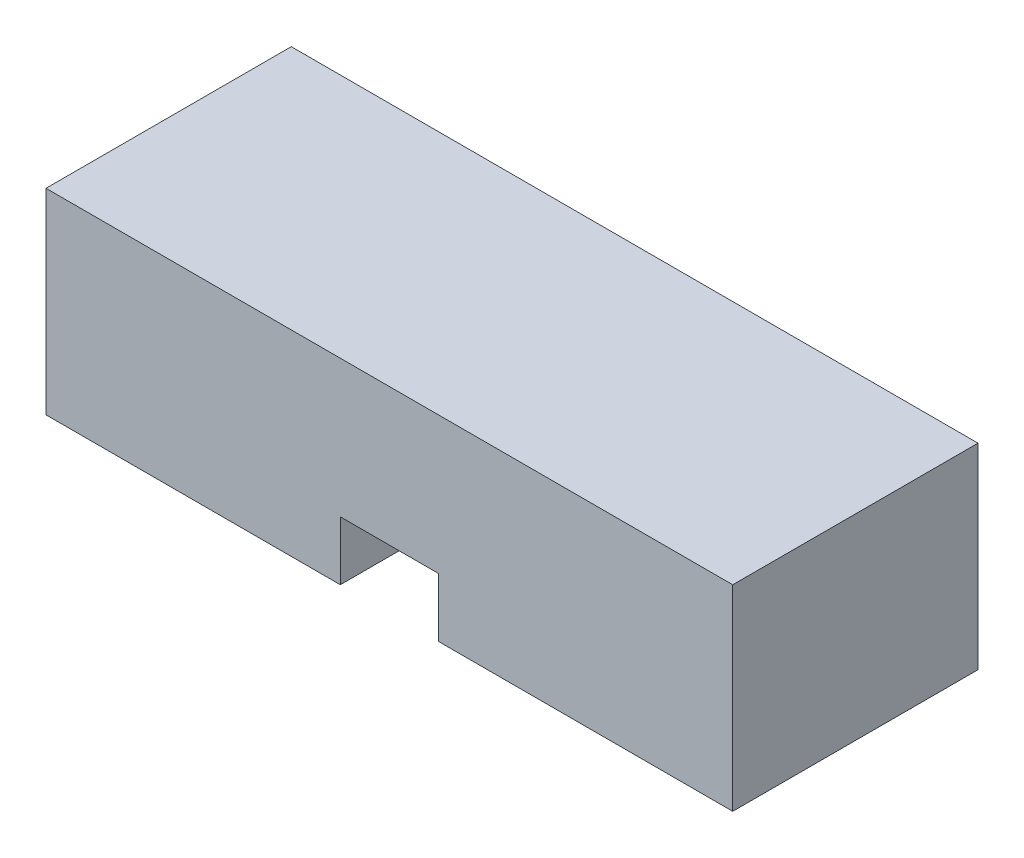
ISO-10303-21;
HEADER;
FILE_DESCRIPTION(('STEP AP214'),'2;1');
FILE_NAME('part.step','',(''),(''),'','','');
FILE_SCHEMA(('AUTOMOTIVE_DESIGN { 1 0 10303 214 1 1 1 1 }'));
ENDSEC;
DATA;
#1=APPLICATION_CONTEXT('core data for automotive mechanical design processes');
#2=APPLICATION_PROTOCOL_DEFINITION('international standard','automotive_design',2000,#1);
#3=PRODUCT_CONTEXT('',#1,'mechanical');
#4=PRODUCT('Part','Part','',(#3));
#5=PRODUCT_RELATED_PRODUCT_CATEGORY('part','',(#4));
#6=PRODUCT_DEFINITION_FORMATION('','',#4);
#7=PRODUCT_DEFINITION_CONTEXT('part definition',#1,'design');
#8=PRODUCT_DEFINITION('design','',#6,#7);
#9=PRODUCT_DEFINITION_SHAPE('','',#8);
#10=(LENGTH_UNIT() NAMED_UNIT(*) SI_UNIT(.MILLI.,.METRE.));
#11=(NAMED_UNIT(*) PLANE_ANGLE_UNIT() SI_UNIT($,.RADIAN.));
#12=(NAMED_UNIT(*) SI_UNIT($,.STERADIAN.) SOLID_ANGLE_UNIT());
#13=UNCERTAINTY_MEASURE_WITH_UNIT(LENGTH_MEASURE(1.E-05),#10,'distance_accuracy_value','');
#14=(GEOMETRIC_REPRESENTATION_CONTEXT(3) GLOBAL_UNCERTAINTY_ASSIGNED_CONTEXT((#13)) GLOBAL_UNIT_ASSIGNED_CONTEXT((#10,
#11,#12)) REPRESENTATION_CONTEXT('',''));
#15=CARTESIAN_POINT('',(0.,0.,0.));
#16=DIRECTION('',(0.,0.,1.));
#17=DIRECTION('',(1.,0.,0.));
#18=AXIS2_PLACEMENT_3D('',#15,#16,#17);
#19=CARTESIAN_POINT('',(0.,-20.,0.));
#20=DIRECTION('',(0.,1.,0.));
#21=DIRECTION('',(0.,0.,1.));
#22=AXIS2_PLACEMENT_3D('',#19,#20,#21);
#23=PLANE('',#22);
#24=DIRECTION('',(1.,0.,0.));
#25=VECTOR('',#24,1.);
#26=CARTESIAN_POINT('',(-35.,-20.,12.5));
#27=LINE('',#26,#25);
#28=CARTESIAN_POINT('',(5.,-20.,12.5));
#29=VERTEX_POINT('',#28);
#30=CARTESIAN_POINT('',(35.,-20.,12.5));
#31=VERTEX_POINT('',#30);
#32=EDGE_CURVE('E222',#29,#31,#27,.T.);
#33=ORIENTED_EDGE('',*,*,#32,.F.);
#34=DIRECTION('',(0.,0.,1.));
#35=VECTOR('',#34,1.);
#36=CARTESIAN_POINT('',(5.,-20.,-12.5));
#37=LINE('',#36,#35);
#38=CARTESIAN_POINT('',(5.,-20.,3.07373240182346));
#39=VERTEX_POINT('',#38);
#40=EDGE_CURVE('E163',#39,#29,#37,.T.);
#41=ORIENTED_EDGE('',*,*,#40,.F.);
#42=CARTESIAN_POINT('',(10.95,-20.,-2.19883812876217));
#43=DIRECTION('',(0.,-1.,0.));
#44=DIRECTION('',(0.,0.,-1.));
#45=AXIS2_PLACEMENT_3D('',#42,#43,#44);
#46=CIRCLE('',#45,7.95);
#47=CARTESIAN_POINT('',(5.,-20.,-7.4714086593478));
#48=VERTEX_POINT('',#47);
#49=EDGE_CURVE('E198',#48,#39,#46,.T.);
#50=ORIENTED_EDGE('',*,*,#49,.F.);
#51=CARTESIAN_POINT('',(5.,-20.,-12.5));
#52=VERTEX_POINT('',#51);
#53=EDGE_CURVE('E184',#52,#48,#37,.T.);
#54=ORIENTED_EDGE('',*,*,#53,.F.);
#55=DIRECTION('',(-1.,0.,0.));
#56=VECTOR('',#55,1.);
#57=CARTESIAN_POINT('',(-35.,-20.,-12.5));
#58=LINE('',#57,#56);
#59=CARTESIAN_POINT('',(35.,-20.,-12.5));
#60=VERTEX_POINT('',#59);
#61=EDGE_CURVE('E216',#60,#52,#58,.T.);
#62=ORIENTED_EDGE('',*,*,#61,.F.);
#63=DIRECTION('',(0.,0.,-1.));
#64=VECTOR('',#63,1.);
#65=CARTESIAN_POINT('',(35.,-20.,-12.5));
#66=LINE('',#65,#64);
#67=EDGE_CURVE('E211',#31,#60,#66,.T.);
#68=ORIENTED_EDGE('',*,*,#67,.F.);
#69=EDGE_LOOP('',(#33,#41,#50,#54,#62,#68));
#70=FACE_BOUND('',#69,.T.);
#71=ADVANCED_FACE('F35',(#70),#23,.F.);
#72=CARTESIAN_POINT('',(35.,-20.,-12.5));
#73=DIRECTION('',(1.,0.,0.));
#74=DIRECTION('',(0.,0.,-1.));
#75=AXIS2_PLACEMENT_3D('',#72,#73,#74);
#76=PLANE('',#75);
#77=DIRECTION('',(0.,0.,-1.));
#78=VECTOR('',#77,1.);
#79=CARTESIAN_POINT('',(35.,0.,-12.5));
#80=LINE('',#79,#78);
#81=CARTESIAN_POINT('',(35.,0.,12.5));
#82=VERTEX_POINT('',#81);
#83=CARTESIAN_POINT('',(35.,0.,-12.5));
#84=VERTEX_POINT('',#83);
#85=EDGE_CURVE('E208',#82,#84,#80,.T.);
#86=ORIENTED_EDGE('',*,*,#85,.F.);
#87=DIRECTION('',(0.,1.,0.));
#88=VECTOR('',#87,1.);
#89=CARTESIAN_POINT('',(35.,-20.,12.5));
#90=LINE('',#89,#88);
#91=EDGE_CURVE('E236',#31,#82,#90,.T.);
#92=ORIENTED_EDGE('',*,*,#91,.F.);
#93=ORIENTED_EDGE('',*,*,#67,.T.);
#94=DIRECTION('',(0.,1.,0.));
#95=VECTOR('',#94,1.);
#96=CARTESIAN_POINT('',(35.,-20.,-12.5));
#97=LINE('',#96,#95);
#98=EDGE_CURVE('E225',#60,#84,#97,.T.);
#99=ORIENTED_EDGE('',*,*,#98,.T.);
#100=EDGE_LOOP('',(#86,#92,#93,#99));
#101=FACE_BOUND('',#100,.T.);
#102=ADVANCED_FACE('F296',(#101),#76,.T.);
#103=CARTESIAN_POINT('',(-35.,-20.,12.5));
#104=DIRECTION('',(0.,0.,1.));
#105=DIRECTION('',(1.,0.,0.));
#106=AXIS2_PLACEMENT_3D('',#103,#104,#105);
#107=PLANE('',#106);
#108=DIRECTION('',(-1.,0.,0.));
#109=VECTOR('',#108,1.);
#110=CARTESIAN_POINT('',(-5.,-14.,12.5));
#111=LINE('',#110,#109);
#112=CARTESIAN_POINT('',(5.,-14.,12.5));
#113=VERTEX_POINT('',#112);
#114=CARTESIAN_POINT('',(-5.,-14.,12.5));
#115=VERTEX_POINT('',#114);
#116=EDGE_CURVE('E152',#113,#115,#111,.T.);
#117=ORIENTED_EDGE('',*,*,#116,.F.);
#118=DIRECTION('',(0.,-1.,0.));
#119=VECTOR('',#118,1.);
#120=CARTESIAN_POINT('',(5.,-16.,12.5));
#121=LINE('',#120,#119);
#122=EDGE_CURVE('E160',#113,#29,#121,.T.);
#123=ORIENTED_EDGE('',*,*,#122,.T.);
#124=ORIENTED_EDGE('',*,*,#32,.T.);
#125=ORIENTED_EDGE('',*,*,#91,.T.);
#126=DIRECTION('',(1.,0.,0.));
#127=VECTOR('',#126,1.);
#128=CARTESIAN_POINT('',(-35.,0.,12.5));
#129=LINE('',#128,#127);
#130=CARTESIAN_POINT('',(-35.,0.,12.5));
#131=VERTEX_POINT('',#130);
#132=EDGE_CURVE('E215',#131,#82,#129,.T.);
#133=ORIENTED_EDGE('',*,*,#132,.F.);
#134=DIRECTION('',(0.,1.,0.));
#135=VECTOR('',#134,1.);
#136=CARTESIAN_POINT('',(-35.,-20.,12.5));
#137=LINE('',#136,#135);
#138=CARTESIAN_POINT('',(-35.,-20.,12.5));
#139=VERTEX_POINT('',#138);
#140=EDGE_CURVE('E239',#139,#131,#137,.T.);
#141=ORIENTED_EDGE('',*,*,#140,.F.);
#142=CARTESIAN_POINT('',(-5.,-20.,12.5));
#143=VERTEX_POINT('',#142);
#144=EDGE_CURVE('E223',#139,#143,#27,.T.);
#145=ORIENTED_EDGE('',*,*,#144,.T.);
#146=DIRECTION('',(0.,-1.,0.));
#147=VECTOR('',#146,1.);
#148=CARTESIAN_POINT('',(-5.,-16.,12.5));
#149=LINE('',#148,#147);
#150=EDGE_CURVE('E166',#115,#143,#149,.T.);
#151=ORIENTED_EDGE('',*,*,#150,.F.);
#152=EDGE_LOOP('',(#117,#123,#124,#125,#133,#141,#145,#151));
#153=FACE_BOUND('',#152,.T.);
#154=ADVANCED_FACE('F169',(#153),#107,.T.);
#155=CARTESIAN_POINT('',(-35.,-20.,-12.5));
#156=DIRECTION('',(-1.,0.,0.));
#157=DIRECTION('',(0.,0.,1.));
#158=AXIS2_PLACEMENT_3D('',#155,#156,#157);
#159=PLANE('',#158);
#160=DIRECTION('',(0.,0.,1.));
#161=VECTOR('',#160,1.);
#162=CARTESIAN_POINT('',(-35.,0.,-12.5));
#163=LINE('',#162,#161);
#164=CARTESIAN_POINT('',(-35.,0.,-12.5));
#165=VERTEX_POINT('',#164);
#166=EDGE_CURVE('E231',#165,#131,#163,.T.);
#167=ORIENTED_EDGE('',*,*,#166,.F.);
#168=DIRECTION('',(0.,1.,0.));
#169=VECTOR('',#168,1.);
#170=CARTESIAN_POINT('',(-35.,-20.,-12.5));
#171=LINE('',#170,#169);
#172=CARTESIAN_POINT('',(-35.,-20.,-12.5));
#173=VERTEX_POINT('',#172);
#174=EDGE_CURVE('E241',#173,#165,#171,.T.);
#175=ORIENTED_EDGE('',*,*,#174,.F.);
#176=DIRECTION('',(0.,0.,1.));
#177=VECTOR('',#176,1.);
#178=CARTESIAN_POINT('',(-35.,-20.,-12.5));
#179=LINE('',#178,#177);
#180=EDGE_CURVE('E219',#173,#139,#179,.T.);
#181=ORIENTED_EDGE('',*,*,#180,.T.);
#182=ORIENTED_EDGE('',*,*,#140,.T.);
#183=EDGE_LOOP('',(#167,#175,#181,#182));
#184=FACE_BOUND('',#183,.T.);
#185=ADVANCED_FACE('F305',(#184),#159,.T.);
#186=CARTESIAN_POINT('',(-35.,-20.,-12.5));
#187=DIRECTION('',(0.,0.,-1.));
#188=DIRECTION('',(-1.,0.,0.));
#189=AXIS2_PLACEMENT_3D('',#186,#187,#188);
#190=PLANE('',#189);
#191=DIRECTION('',(0.,-1.,0.));
#192=VECTOR('',#191,1.);
#193=CARTESIAN_POINT('',(5.,-16.,-12.5));
#194=LINE('',#193,#192);
#195=CARTESIAN_POINT('',(5.,-16.,-12.5));
#196=VERTEX_POINT('',#195);
#197=EDGE_CURVE('E189',#196,#52,#194,.T.);
#198=ORIENTED_EDGE('',*,*,#197,.F.);
#199=DIRECTION('',(1.,0.,0.));
#200=VECTOR('',#199,1.);
#201=CARTESIAN_POINT('',(-5.,-16.,-12.5));
#202=LINE('',#201,#200);
#203=CARTESIAN_POINT('',(-5.,-16.,-12.5));
#204=VERTEX_POINT('',#203);
#205=EDGE_CURVE('E167',#204,#196,#202,.T.);
#206=ORIENTED_EDGE('',*,*,#205,.F.);
#207=DIRECTION('',(0.,-1.,0.));
#208=VECTOR('',#207,1.);
#209=CARTESIAN_POINT('',(-5.,-16.,-12.5));
#210=LINE('',#209,#208);
#211=CARTESIAN_POINT('',(-5.,-20.,-12.5));
#212=VERTEX_POINT('',#211);
#213=EDGE_CURVE('E192',#204,#212,#210,.T.);
#214=ORIENTED_EDGE('',*,*,#213,.T.);
#215=EDGE_CURVE('E214',#212,#173,#58,.T.);
#216=ORIENTED_EDGE('',*,*,#215,.T.);
#217=ORIENTED_EDGE('',*,*,#174,.T.);
#218=DIRECTION('',(-1.,0.,0.));
#219=VECTOR('',#218,1.);
#220=CARTESIAN_POINT('',(-35.,0.,-12.5));
#221=LINE('',#220,#219);
#222=EDGE_CURVE('E228',#84,#165,#221,.T.);
#223=ORIENTED_EDGE('',*,*,#222,.F.);
#224=ORIENTED_EDGE('',*,*,#98,.F.);
#225=ORIENTED_EDGE('',*,*,#61,.T.);
#226=EDGE_LOOP('',(#198,#206,#214,#216,#217,#223,#224,#225));
#227=FACE_BOUND('',#226,.T.);
#228=ADVANCED_FACE('F323',(#227),#190,.T.);
#229=ORIENTED_EDGE('',*,*,#215,.F.);
#230=DIRECTION('',(0.,0.,-1.));
#231=VECTOR('',#230,1.);
#232=CARTESIAN_POINT('',(-5.,-20.,-12.5));
#233=LINE('',#232,#231);
#234=CARTESIAN_POINT('',(-5.,-20.,-7.4714086593478));
#235=VERTEX_POINT('',#234);
#236=EDGE_CURVE('E186',#235,#212,#233,.T.);
#237=ORIENTED_EDGE('',*,*,#236,.F.);
#238=CARTESIAN_POINT('',(-10.95,-20.,-2.19883812876217));
#239=DIRECTION('',(0.,-1.,0.));
#240=DIRECTION('',(0.,0.,-1.));
#241=AXIS2_PLACEMENT_3D('',#238,#239,#240);
#242=CIRCLE('',#241,7.95);
#243=CARTESIAN_POINT('',(-5.,-20.,3.07373240182346));
#244=VERTEX_POINT('',#243);
#245=EDGE_CURVE('E202',#244,#235,#242,.T.);
#246=ORIENTED_EDGE('',*,*,#245,.F.);
#247=EDGE_CURVE('E187',#143,#244,#233,.T.);
#248=ORIENTED_EDGE('',*,*,#247,.F.);
#249=ORIENTED_EDGE('',*,*,#144,.F.);
#250=ORIENTED_EDGE('',*,*,#180,.F.);
#251=EDGE_LOOP('',(#229,#237,#246,#248,#249,#250));
#252=FACE_BOUND('',#251,.T.);
#253=ADVANCED_FACE('F309',(#252),#23,.F.);
#254=CARTESIAN_POINT('',(0.,0.,0.));
#255=DIRECTION('',(0.,1.,0.));
#256=DIRECTION('',(0.,0.,1.));
#257=AXIS2_PLACEMENT_3D('',#254,#255,#256);
#258=PLANE('',#257);
#259=ORIENTED_EDGE('',*,*,#85,.T.);
#260=ORIENTED_EDGE('',*,*,#222,.T.);
#261=ORIENTED_EDGE('',*,*,#166,.T.);
#262=ORIENTED_EDGE('',*,*,#132,.T.);
#263=EDGE_LOOP('',(#259,#260,#261,#262));
#264=FACE_BOUND('',#263,.T.);
#265=ADVANCED_FACE('F299',(#264),#258,.T.);
#266=CARTESIAN_POINT('',(-10.95,-13.,-2.19883812876217));
#267=DIRECTION('',(0.,-1.,0.));
#268=DIRECTION('',(0.,0.,-1.));
#269=AXIS2_PLACEMENT_3D('',#266,#267,#268);
#270=CYLINDRICAL_SURFACE('',#269,7.95);
#271=ORIENTED_EDGE('',*,*,#245,.T.);
#272=DIRECTION('',(0.,-1.,0.));
#273=VECTOR('',#272,1.);
#274=CARTESIAN_POINT('',(-5.,-13.,-7.4714086593478));
#275=LINE('',#274,#273);
#276=CARTESIAN_POINT('',(-5.,-16.,-7.4714086593478));
#277=VERTEX_POINT('',#276);
#278=EDGE_CURVE('E255',#235,#277,#275,.F.);
#279=ORIENTED_EDGE('',*,*,#278,.T.);
#280=CARTESIAN_POINT('',(-10.95,-16.,-2.19883812876217));
#281=DIRECTION('',(0.,1.,0.));
#282=DIRECTION('',(0.,0.,1.));
#283=AXIS2_PLACEMENT_3D('',#280,#281,#282);
#284=CIRCLE('',#283,7.95);
#285=CARTESIAN_POINT('',(-5.,-16.,3.07373240182346));
#286=VERTEX_POINT('',#285);
#287=EDGE_CURVE('E191',#277,#286,#284,.F.);
#288=ORIENTED_EDGE('',*,*,#287,.T.);
#289=DIRECTION('',(0.,-1.,0.));
#290=VECTOR('',#289,1.);
#291=CARTESIAN_POINT('',(-5.,-13.,3.07373240182346));
#292=LINE('',#291,#290);
#293=EDGE_CURVE('E252',#286,#244,#292,.T.);
#294=ORIENTED_EDGE('',*,*,#293,.T.);
#295=EDGE_LOOP('',(#271,#279,#288,#294));
#296=FACE_BOUND('',#295,.T.);
#297=CARTESIAN_POINT('',(-10.95,-13.,-2.19883812876217));
#298=DIRECTION('',(0.,-1.,0.));
#299=DIRECTION('',(0.,0.,-1.));
#300=AXIS2_PLACEMENT_3D('',#297,#298,#299);
#301=CIRCLE('',#300,7.95);
#302=CARTESIAN_POINT('',(-10.95,-13.,-10.1488381287622));
#303=VERTEX_POINT('',#302);
#304=EDGE_CURVE('E205',#303,#303,#301,.T.);
#305=ORIENTED_EDGE('',*,*,#304,.F.);
#306=EDGE_LOOP('',(#305));
#307=FACE_BOUND('',#306,.T.);
#308=ADVANCED_FACE('F314',(#296,#307),#270,.F.);
#309=CARTESIAN_POINT('',(-10.95,-13.,-2.19883812876217));
#310=DIRECTION('',(0.,-1.,0.));
#311=DIRECTION('',(0.,0.,-1.));
#312=AXIS2_PLACEMENT_3D('',#309,#310,#311);
#313=PLANE('',#312);
#314=ORIENTED_EDGE('',*,*,#304,.T.);
#315=EDGE_LOOP('',(#314));
#316=FACE_BOUND('',#315,.T.);
#317=ADVANCED_FACE('F375',(#316),#313,.T.);
#318=CARTESIAN_POINT('',(10.95,-13.,-2.19883812876217));
#319=DIRECTION('',(0.,-1.,0.));
#320=DIRECTION('',(0.,0.,-1.));
#321=AXIS2_PLACEMENT_3D('',#318,#319,#320);
#322=CYLINDRICAL_SURFACE('',#321,7.95);
#323=ORIENTED_EDGE('',*,*,#49,.T.);
#324=DIRECTION('',(0.,-1.,0.));
#325=VECTOR('',#324,1.);
#326=CARTESIAN_POINT('',(5.,-13.,3.07373240182346));
#327=LINE('',#326,#325);
#328=CARTESIAN_POINT('',(5.,-16.,3.07373240182346));
#329=VERTEX_POINT('',#328);
#330=EDGE_CURVE('E249',#39,#329,#327,.F.);
#331=ORIENTED_EDGE('',*,*,#330,.T.);
#332=CARTESIAN_POINT('',(10.95,-16.,-2.19883812876217));
#333=DIRECTION('',(0.,1.,0.));
#334=DIRECTION('',(0.,0.,1.));
#335=AXIS2_PLACEMENT_3D('',#332,#333,#334);
#336=CIRCLE('',#335,7.95);
#337=CARTESIAN_POINT('',(5.,-16.,-7.4714086593478));
#338=VERTEX_POINT('',#337);
#339=EDGE_CURVE('E238',#329,#338,#336,.F.);
#340=ORIENTED_EDGE('',*,*,#339,.T.);
#341=DIRECTION('',(0.,-1.,0.));
#342=VECTOR('',#341,1.);
#343=CARTESIAN_POINT('',(5.,-13.,-7.4714086593478));
#344=LINE('',#343,#342);
#345=EDGE_CURVE('E246',#338,#48,#344,.T.);
#346=ORIENTED_EDGE('',*,*,#345,.T.);
#347=EDGE_LOOP('',(#323,#331,#340,#346));
#348=FACE_BOUND('',#347,.T.);
#349=CARTESIAN_POINT('',(10.95,-13.,-2.19883812876217));
#350=DIRECTION('',(0.,-1.,0.));
#351=DIRECTION('',(0.,0.,-1.));
#352=AXIS2_PLACEMENT_3D('',#349,#350,#351);
#353=CIRCLE('',#352,7.95);
#354=CARTESIAN_POINT('',(10.95,-13.,-10.1488381287622));
#355=VERTEX_POINT('',#354);
#356=EDGE_CURVE('E199',#355,#355,#353,.T.);
#357=ORIENTED_EDGE('',*,*,#356,.F.);
#358=EDGE_LOOP('',(#357));
#359=FACE_BOUND('',#358,.T.);
#360=ADVANCED_FACE('F284',(#348,#359),#322,.F.);
#361=CARTESIAN_POINT('',(10.95,-13.,-2.19883812876217));
#362=DIRECTION('',(0.,-1.,0.));
#363=DIRECTION('',(0.,0.,-1.));
#364=AXIS2_PLACEMENT_3D('',#361,#362,#363);
#365=PLANE('',#364);
#366=ORIENTED_EDGE('',*,*,#356,.T.);
#367=EDGE_LOOP('',(#366));
#368=FACE_BOUND('',#367,.T.);
#369=ADVANCED_FACE('F366',(#368),#365,.T.);
#370=CARTESIAN_POINT('',(-5.,-16.,-12.5));
#371=DIRECTION('',(-1.,0.,0.));
#372=DIRECTION('',(0.,0.,1.));
#373=AXIS2_PLACEMENT_3D('',#370,#371,#372);
#374=PLANE('',#373);
#375=ORIENTED_EDGE('',*,*,#236,.T.);
#376=ORIENTED_EDGE('',*,*,#213,.F.);
#377=DIRECTION('',(0.,0.,-1.));
#378=VECTOR('',#377,1.);
#379=CARTESIAN_POINT('',(-5.,-16.,-12.5));
#380=LINE('',#379,#378);
#381=EDGE_CURVE('E179',#277,#204,#380,.T.);
#382=ORIENTED_EDGE('',*,*,#381,.F.);
#383=ORIENTED_EDGE('',*,*,#278,.F.);
#384=EDGE_LOOP('',(#375,#376,#382,#383));
#385=FACE_BOUND('',#384,.T.);
#386=ADVANCED_FACE('F319',(#385),#374,.F.);
#387=CARTESIAN_POINT('',(-5.,-16.,6.7));
#388=VERTEX_POINT('',#387);
#389=EDGE_CURVE('E50',#388,#286,#380,.T.);
#390=ORIENTED_EDGE('',*,*,#389,.F.);
#391=DIRECTION('',(0.,-1.,0.));
#392=VECTOR('',#391,1.);
#393=CARTESIAN_POINT('',(-5.,-14.,6.7));
#394=LINE('',#393,#392);
#395=CARTESIAN_POINT('',(-5.,-14.,6.7));
#396=VERTEX_POINT('',#395);
#397=EDGE_CURVE('E54',#388,#396,#394,.F.);
#398=ORIENTED_EDGE('',*,*,#397,.T.);
#399=DIRECTION('',(0.,0.,-1.));
#400=VECTOR('',#399,1.);
#401=CARTESIAN_POINT('',(-5.,-14.,3.5));
#402=LINE('',#401,#400);
#403=EDGE_CURVE('E171',#115,#396,#402,.T.);
#404=ORIENTED_EDGE('',*,*,#403,.F.);
#405=ORIENTED_EDGE('',*,*,#150,.T.);
#406=ORIENTED_EDGE('',*,*,#247,.T.);
#407=ORIENTED_EDGE('',*,*,#293,.F.);
#408=EDGE_LOOP('',(#390,#398,#404,#405,#406,#407));
#409=FACE_BOUND('',#408,.T.);
#410=ADVANCED_FACE('F312',(#409),#374,.F.);
#411=CARTESIAN_POINT('',(5.,-16.,-12.5));
#412=DIRECTION('',(1.,0.,0.));
#413=DIRECTION('',(0.,0.,-1.));
#414=AXIS2_PLACEMENT_3D('',#411,#412,#413);
#415=PLANE('',#414);
#416=DIRECTION('',(0.,0.,1.));
#417=VECTOR('',#416,1.);
#418=CARTESIAN_POINT('',(5.,-14.,3.5));
#419=LINE('',#418,#417);
#420=CARTESIAN_POINT('',(5.,-14.,6.7));
#421=VERTEX_POINT('',#420);
#422=EDGE_CURVE('E147',#421,#113,#419,.T.);
#423=ORIENTED_EDGE('',*,*,#422,.F.);
#424=DIRECTION('',(0.,-1.,0.));
#425=VECTOR('',#424,1.);
#426=CARTESIAN_POINT('',(5.,-16.,6.7));
#427=LINE('',#426,#425);
#428=CARTESIAN_POINT('',(5.,-16.,6.7));
#429=VERTEX_POINT('',#428);
#430=EDGE_CURVE('E261',#421,#429,#427,.T.);
#431=ORIENTED_EDGE('',*,*,#430,.T.);
#432=DIRECTION('',(0.,0.,1.));
#433=VECTOR('',#432,1.);
#434=CARTESIAN_POINT('',(5.,-16.,-12.5));
#435=LINE('',#434,#433);
#436=EDGE_CURVE('E180',#329,#429,#435,.T.);
#437=ORIENTED_EDGE('',*,*,#436,.F.);
#438=ORIENTED_EDGE('',*,*,#330,.F.);
#439=ORIENTED_EDGE('',*,*,#40,.T.);
#440=ORIENTED_EDGE('',*,*,#122,.F.);
#441=EDGE_LOOP('',(#423,#431,#437,#438,#439,#440));
#442=FACE_BOUND('',#441,.T.);
#443=ADVANCED_FACE('F161',(#442),#415,.F.);
#444=EDGE_CURVE('E177',#196,#338,#435,.T.);
#445=ORIENTED_EDGE('',*,*,#444,.F.);
#446=ORIENTED_EDGE('',*,*,#197,.T.);
#447=ORIENTED_EDGE('',*,*,#53,.T.);
#448=ORIENTED_EDGE('',*,*,#345,.F.);
#449=EDGE_LOOP('',(#445,#446,#447,#448));
#450=FACE_BOUND('',#449,.T.);
#451=ADVANCED_FACE('F325',(#450),#415,.F.);
#452=CARTESIAN_POINT('',(0.,-16.,0.));
#453=DIRECTION('',(0.,1.,0.));
#454=DIRECTION('',(0.,0.,1.));
#455=AXIS2_PLACEMENT_3D('',#452,#453,#454);
#456=PLANE('',#455);
#457=ORIENTED_EDGE('',*,*,#436,.T.);
#458=CARTESIAN_POINT('',(1.8,-16.,6.7));
#459=DIRECTION('',(0.,1.,0.));
#460=DIRECTION('',(0.,0.,1.));
#461=AXIS2_PLACEMENT_3D('',#458,#459,#460);
#462=CIRCLE('',#461,3.2);
#463=CARTESIAN_POINT('',(1.8,-16.,3.5));
#464=VERTEX_POINT('',#463);
#465=EDGE_CURVE('E43',#429,#464,#462,.T.);
#466=ORIENTED_EDGE('',*,*,#465,.T.);
#467=DIRECTION('',(-1.,0.,0.));
#468=VECTOR('',#467,1.);
#469=CARTESIAN_POINT('',(0.,-16.,3.5));
#470=LINE('',#469,#468);
#471=CARTESIAN_POINT('',(-1.8,-16.,3.5));
#472=VERTEX_POINT('',#471);
#473=EDGE_CURVE('E258',#464,#472,#470,.T.);
#474=ORIENTED_EDGE('',*,*,#473,.T.);
#475=CARTESIAN_POINT('',(-1.8,-16.,6.7));
#476=DIRECTION('',(0.,1.,0.));
#477=DIRECTION('',(0.,0.,1.));
#478=AXIS2_PLACEMENT_3D('',#475,#476,#477);
#479=CIRCLE('',#478,3.2);
#480=EDGE_CURVE('E11',#472,#388,#479,.T.);
#481=ORIENTED_EDGE('',*,*,#480,.T.);
#482=ORIENTED_EDGE('',*,*,#389,.T.);
#483=ORIENTED_EDGE('',*,*,#287,.F.);
#484=ORIENTED_EDGE('',*,*,#381,.T.);
#485=ORIENTED_EDGE('',*,*,#205,.T.);
#486=ORIENTED_EDGE('',*,*,#444,.T.);
#487=ORIENTED_EDGE('',*,*,#339,.F.);
#488=EDGE_LOOP('',(#457,#466,#474,#481,#482,#483,#484,#485,#486,#487));
#489=FACE_BOUND('',#488,.T.);
#490=ADVANCED_FACE('F274',(#489),#456,.F.);
#491=CARTESIAN_POINT('',(-5.,-14.,3.5));
#492=DIRECTION('',(0.,0.,-1.));
#493=DIRECTION('',(-1.,0.,0.));
#494=AXIS2_PLACEMENT_3D('',#491,#492,#493);
#495=PLANE('',#494);
#496=ORIENTED_EDGE('',*,*,#473,.F.);
#497=DIRECTION('',(0.,-1.,0.));
#498=VECTOR('',#497,1.);
#499=CARTESIAN_POINT('',(1.8,-14.,3.5));
#500=LINE('',#499,#498);
#501=CARTESIAN_POINT('',(1.8,-14.,3.5));
#502=VERTEX_POINT('',#501);
#503=EDGE_CURVE('E266',#464,#502,#500,.F.);
#504=ORIENTED_EDGE('',*,*,#503,.T.);
#505=DIRECTION('',(1.,0.,0.));
#506=VECTOR('',#505,1.);
#507=CARTESIAN_POINT('',(-5.,-14.,3.5));
#508=LINE('',#507,#506);
#509=CARTESIAN_POINT('',(-1.8,-14.,3.5));
#510=VERTEX_POINT('',#509);
#511=EDGE_CURVE('E173',#510,#502,#508,.T.);
#512=ORIENTED_EDGE('',*,*,#511,.F.);
#513=DIRECTION('',(0.,-1.,0.));
#514=VECTOR('',#513,1.);
#515=CARTESIAN_POINT('',(-1.8,-16.,3.5));
#516=LINE('',#515,#514);
#517=EDGE_CURVE('E263',#510,#472,#516,.T.);
#518=ORIENTED_EDGE('',*,*,#517,.T.);
#519=EDGE_LOOP('',(#496,#504,#512,#518));
#520=FACE_BOUND('',#519,.T.);
#521=ADVANCED_FACE('F279',(#520),#495,.F.);
#522=CARTESIAN_POINT('',(0.,-14.,0.));
#523=DIRECTION('',(0.,1.,0.));
#524=DIRECTION('',(0.,0.,1.));
#525=AXIS2_PLACEMENT_3D('',#522,#523,#524);
#526=PLANE('',#525);
#527=ORIENTED_EDGE('',*,*,#511,.T.);
#528=CARTESIAN_POINT('',(1.8,-14.,6.7));
#529=DIRECTION('',(0.,1.,0.));
#530=DIRECTION('',(0.,0.,1.));
#531=AXIS2_PLACEMENT_3D('',#528,#529,#530);
#532=CIRCLE('',#531,3.2);
#533=EDGE_CURVE('E154',#502,#421,#532,.F.);
#534=ORIENTED_EDGE('',*,*,#533,.T.);
#535=ORIENTED_EDGE('',*,*,#422,.T.);
#536=ORIENTED_EDGE('',*,*,#116,.T.);
#537=ORIENTED_EDGE('',*,*,#403,.T.);
#538=CARTESIAN_POINT('',(-1.8,-14.,6.7));
#539=DIRECTION('',(0.,1.,0.));
#540=DIRECTION('',(0.,0.,1.));
#541=AXIS2_PLACEMENT_3D('',#538,#539,#540);
#542=CIRCLE('',#541,3.2);
#543=EDGE_CURVE('E268',#396,#510,#542,.F.);
#544=ORIENTED_EDGE('',*,*,#543,.T.);
#545=EDGE_LOOP('',(#527,#534,#535,#536,#537,#544));
#546=FACE_BOUND('',#545,.T.);
#547=ADVANCED_FACE('F150',(#546),#526,.F.);
#548=CARTESIAN_POINT('',(1.8,-16.,6.7));
#549=DIRECTION('',(0.,1.,0.));
#550=DIRECTION('',(0.,0.,1.));
#551=AXIS2_PLACEMENT_3D('',#548,#549,#550);
#552=CYLINDRICAL_SURFACE('',#551,3.2);
#553=ORIENTED_EDGE('',*,*,#533,.F.);
#554=ORIENTED_EDGE('',*,*,#503,.F.);
#555=ORIENTED_EDGE('',*,*,#465,.F.);
#556=ORIENTED_EDGE('',*,*,#430,.F.);
#557=EDGE_LOOP('',(#553,#554,#555,#556));
#558=FACE_BOUND('',#557,.T.);
#559=ADVANCED_FACE('F282',(#558),#552,.F.);
#560=CARTESIAN_POINT('',(-1.8,-14.,6.7));
#561=DIRECTION('',(0.,1.,0.));
#562=DIRECTION('',(0.,0.,1.));
#563=AXIS2_PLACEMENT_3D('',#560,#561,#562);
#564=CYLINDRICAL_SURFACE('',#563,3.2);
#565=ORIENTED_EDGE('',*,*,#543,.F.);
#566=ORIENTED_EDGE('',*,*,#397,.F.);
#567=ORIENTED_EDGE('',*,*,#480,.F.);
#568=ORIENTED_EDGE('',*,*,#517,.F.);
#569=EDGE_LOOP('',(#565,#566,#567,#568));
#570=FACE_BOUND('',#569,.T.);
#571=ADVANCED_FACE('F37',(#570),#564,.F.);
#572=CLOSED_SHELL('',(#71,#102,#154,#185,#228,#253,#265,#308,#317,#360,#369,#386,#410,#443,#451,
#490,#521,#547,#559,#571));
#573=MANIFOLD_SOLID_BREP('B2',#572);
#574=ADVANCED_BREP_SHAPE_REPRESENTATION('',(#18,#573),#14);
#575=SHAPE_DEFINITION_REPRESENTATION(#9,#574);
ENDSEC;
END-ISO-10303-21;
